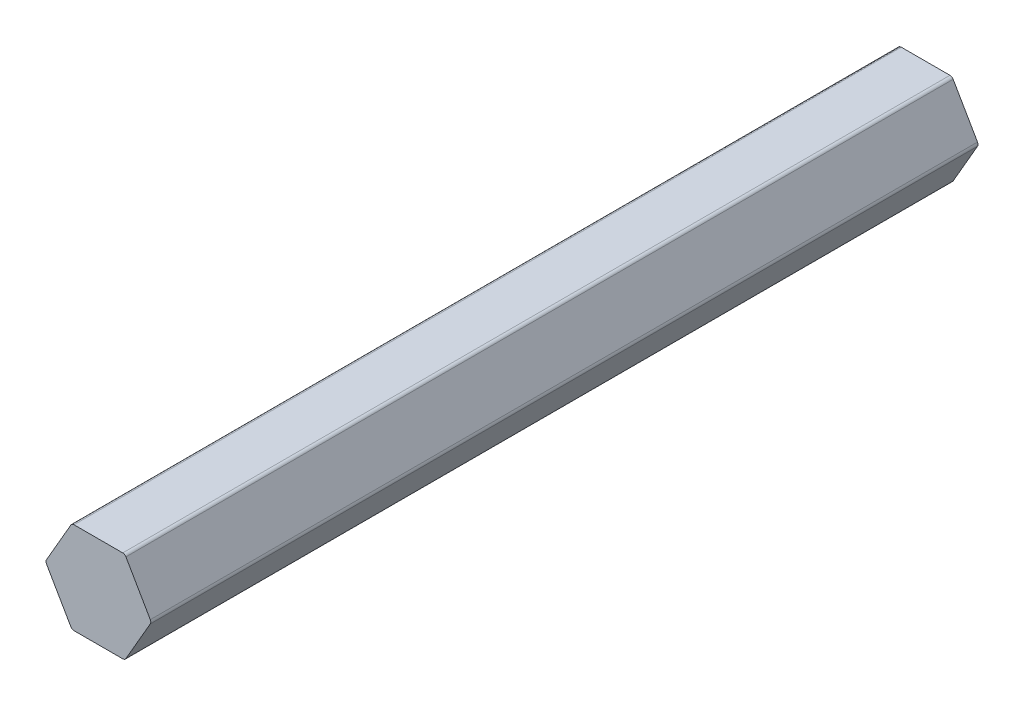
ISO-10303-21;
HEADER;
FILE_DESCRIPTION(('STEP AP214'),'2;1');
FILE_NAME('part.step','',(''),(''),'','','');
FILE_SCHEMA(('AUTOMOTIVE_DESIGN { 1 0 10303 214 1 1 1 1 }'));
ENDSEC;
DATA;
#1=APPLICATION_CONTEXT('core data for automotive mechanical design processes');
#2=APPLICATION_PROTOCOL_DEFINITION('international standard','automotive_design',2000,#1);
#3=PRODUCT_CONTEXT('',#1,'mechanical');
#4=PRODUCT('Part','Part','',(#3));
#5=PRODUCT_RELATED_PRODUCT_CATEGORY('part','',(#4));
#6=PRODUCT_DEFINITION_FORMATION('','',#4);
#7=PRODUCT_DEFINITION_CONTEXT('part definition',#1,'design');
#8=PRODUCT_DEFINITION('design','',#6,#7);
#9=PRODUCT_DEFINITION_SHAPE('','',#8);
#10=(LENGTH_UNIT() NAMED_UNIT(*) SI_UNIT(.MILLI.,.METRE.));
#11=(NAMED_UNIT(*) PLANE_ANGLE_UNIT() SI_UNIT($,.RADIAN.));
#12=(NAMED_UNIT(*) SI_UNIT($,.STERADIAN.) SOLID_ANGLE_UNIT());
#13=UNCERTAINTY_MEASURE_WITH_UNIT(LENGTH_MEASURE(1.E-05),#10,'distance_accuracy_value','');
#14=(GEOMETRIC_REPRESENTATION_CONTEXT(3) GLOBAL_UNCERTAINTY_ASSIGNED_CONTEXT((#13)) GLOBAL_UNIT_ASSIGNED_CONTEXT((#10,
#11,#12)) REPRESENTATION_CONTEXT('',''));
#15=CARTESIAN_POINT('',(0.,0.,0.));
#16=DIRECTION('',(0.,0.,1.));
#17=DIRECTION('',(1.,0.,0.));
#18=AXIS2_PLACEMENT_3D('',#15,#16,#17);
#19=CARTESIAN_POINT('',(-3.36554792418708,-5.8293,-114.3));
#20=DIRECTION('',(0.,0.,-1.));
#21=DIRECTION('',(-1.,0.,0.));
#22=AXIS2_PLACEMENT_3D('',#19,#20,#21);
#23=CYLINDRICAL_SURFACE('',#22,0.507999999999999);
#24=CARTESIAN_POINT('',(-3.36554792418708,-5.8293,-228.6));
#25=DIRECTION('',(0.,0.,-1.));
#26=DIRECTION('',(-1.,0.,0.));
#27=AXIS2_PLACEMENT_3D('',#24,#25,#26);
#28=CIRCLE('',#27,0.507999999999999);
#29=CARTESIAN_POINT('',(-3.36554792418708,-6.3373,-228.6));
#30=VERTEX_POINT('',#29);
#31=CARTESIAN_POINT('',(-3.80548882930957,-6.0833,-228.6));
#32=VERTEX_POINT('',#31);
#33=EDGE_CURVE('E155',#30,#32,#28,.T.);
#34=ORIENTED_EDGE('',*,*,#33,.F.);
#35=DIRECTION('',(0.,0.,-1.));
#36=VECTOR('',#35,1.);
#37=CARTESIAN_POINT('',(-3.36554792418708,-6.3373,-114.3));
#38=LINE('',#37,#36);
#39=CARTESIAN_POINT('',(-3.36554792418708,-6.3373,-114.3));
#40=VERTEX_POINT('',#39);
#41=EDGE_CURVE('E11',#40,#30,#38,.T.);
#42=ORIENTED_EDGE('',*,*,#41,.F.);
#43=CARTESIAN_POINT('',(-3.36554792418708,-5.8293,-114.3));
#44=DIRECTION('',(0.,0.,-1.));
#45=DIRECTION('',(-1.,0.,0.));
#46=AXIS2_PLACEMENT_3D('',#43,#44,#45);
#47=CIRCLE('',#46,0.507999999999999);
#48=CARTESIAN_POINT('',(-3.80548882930957,-6.0833,-114.3));
#49=VERTEX_POINT('',#48);
#50=EDGE_CURVE('E187',#40,#49,#47,.T.);
#51=ORIENTED_EDGE('',*,*,#50,.T.);
#52=DIRECTION('',(0.,0.,-1.));
#53=VECTOR('',#52,1.);
#54=CARTESIAN_POINT('',(-3.80548882930957,-6.0833,-114.3));
#55=LINE('',#54,#53);
#56=EDGE_CURVE('E37',#49,#32,#55,.T.);
#57=ORIENTED_EDGE('',*,*,#56,.T.);
#58=EDGE_LOOP('',(#34,#42,#51,#57));
#59=FACE_BOUND('',#58,.T.);
#60=ADVANCED_FACE('F34',(#59),#23,.T.);
#61=CARTESIAN_POINT('',(3.36554792418708,-6.3373,-114.3));
#62=DIRECTION('',(0.,-1.,0.));
#63=DIRECTION('',(1.,0.,0.));
#64=AXIS2_PLACEMENT_3D('',#61,#62,#63);
#65=PLANE('',#64);
#66=DIRECTION('',(-1.,0.,0.));
#67=VECTOR('',#66,1.);
#68=CARTESIAN_POINT('',(3.36554792418708,-6.3373,-228.6));
#69=LINE('',#68,#67);
#70=CARTESIAN_POINT('',(3.36554792418708,-6.3373,-228.6));
#71=VERTEX_POINT('',#70);
#72=EDGE_CURVE('E185',#71,#30,#69,.T.);
#73=ORIENTED_EDGE('',*,*,#72,.F.);
#74=DIRECTION('',(0.,0.,-1.));
#75=VECTOR('',#74,1.);
#76=CARTESIAN_POINT('',(3.36554792418708,-6.3373,-114.3));
#77=LINE('',#76,#75);
#78=CARTESIAN_POINT('',(3.36554792418708,-6.3373,-114.3));
#79=VERTEX_POINT('',#78);
#80=EDGE_CURVE('E43',#79,#71,#77,.T.);
#81=ORIENTED_EDGE('',*,*,#80,.F.);
#82=DIRECTION('',(-1.,0.,0.));
#83=VECTOR('',#82,1.);
#84=CARTESIAN_POINT('',(3.36554792418708,-6.3373,-114.3));
#85=LINE('',#84,#83);
#86=EDGE_CURVE('E145',#79,#40,#85,.T.);
#87=ORIENTED_EDGE('',*,*,#86,.T.);
#88=ORIENTED_EDGE('',*,*,#41,.T.);
#89=EDGE_LOOP('',(#73,#81,#87,#88));
#90=FACE_BOUND('',#89,.T.);
#91=ADVANCED_FACE('F207',(#90),#65,.T.);
#92=CARTESIAN_POINT('',(3.36554792418709,-5.8293,-114.3));
#93=DIRECTION('',(0.,0.,-1.));
#94=DIRECTION('',(-1.,0.,0.));
#95=AXIS2_PLACEMENT_3D('',#92,#93,#94);
#96=CYLINDRICAL_SURFACE('',#95,0.508);
#97=CARTESIAN_POINT('',(3.36554792418709,-5.8293,-228.6));
#98=DIRECTION('',(0.,0.,-1.));
#99=DIRECTION('',(-1.,0.,0.));
#100=AXIS2_PLACEMENT_3D('',#97,#98,#99);
#101=CIRCLE('',#100,0.508);
#102=CARTESIAN_POINT('',(3.80548882930958,-6.0833,-228.6));
#103=VERTEX_POINT('',#102);
#104=EDGE_CURVE('E132',#103,#71,#101,.T.);
#105=ORIENTED_EDGE('',*,*,#104,.F.);
#106=DIRECTION('',(0.,0.,-1.));
#107=VECTOR('',#106,1.);
#108=CARTESIAN_POINT('',(3.80548882930958,-6.0833,-114.3));
#109=LINE('',#108,#107);
#110=CARTESIAN_POINT('',(3.80548882930958,-6.0833,-114.3));
#111=VERTEX_POINT('',#110);
#112=EDGE_CURVE('E127',#111,#103,#109,.T.);
#113=ORIENTED_EDGE('',*,*,#112,.F.);
#114=CARTESIAN_POINT('',(3.36554792418709,-5.8293,-114.3));
#115=DIRECTION('',(0.,0.,-1.));
#116=DIRECTION('',(-1.,0.,0.));
#117=AXIS2_PLACEMENT_3D('',#114,#115,#116);
#118=CIRCLE('',#117,0.508);
#119=EDGE_CURVE('E130',#111,#79,#118,.T.);
#120=ORIENTED_EDGE('',*,*,#119,.T.);
#121=ORIENTED_EDGE('',*,*,#80,.T.);
#122=EDGE_LOOP('',(#105,#113,#120,#121));
#123=FACE_BOUND('',#122,.T.);
#124=ADVANCED_FACE('F129',(#123),#96,.T.);
#125=CARTESIAN_POINT('',(7.17103675349666,-0.253999999999997,-114.3));
#126=DIRECTION('',(0.866025403784439,-0.499999999999999,0.));
#127=DIRECTION('',(0.499999999999999,0.866025403784439,0.));
#128=AXIS2_PLACEMENT_3D('',#125,#126,#127);
#129=PLANE('',#128);
#130=DIRECTION('',(-0.499999999999999,-0.866025403784439,0.));
#131=VECTOR('',#130,1.);
#132=CARTESIAN_POINT('',(7.17103675349666,-0.253999999999997,-228.6));
#133=LINE('',#132,#131);
#134=CARTESIAN_POINT('',(7.17103675349666,-0.253999999999997,-228.6));
#135=VERTEX_POINT('',#134);
#136=EDGE_CURVE('E182',#135,#103,#133,.T.);
#137=ORIENTED_EDGE('',*,*,#136,.F.);
#138=DIRECTION('',(0.,0.,-1.));
#139=VECTOR('',#138,1.);
#140=CARTESIAN_POINT('',(7.17103675349666,-0.253999999999997,-114.3));
#141=LINE('',#140,#139);
#142=CARTESIAN_POINT('',(7.17103675349666,-0.253999999999997,-114.3));
#143=VERTEX_POINT('',#142);
#144=EDGE_CURVE('E137',#143,#135,#141,.T.);
#145=ORIENTED_EDGE('',*,*,#144,.F.);
#146=DIRECTION('',(-0.499999999999999,-0.866025403784439,0.));
#147=VECTOR('',#146,1.);
#148=CARTESIAN_POINT('',(7.17103675349666,-0.253999999999997,-114.3));
#149=LINE('',#148,#147);
#150=EDGE_CURVE('E143',#143,#111,#149,.T.);
#151=ORIENTED_EDGE('',*,*,#150,.T.);
#152=ORIENTED_EDGE('',*,*,#112,.T.);
#153=EDGE_LOOP('',(#137,#145,#151,#152));
#154=FACE_BOUND('',#153,.T.);
#155=ADVANCED_FACE('F147',(#154),#129,.T.);
#156=CARTESIAN_POINT('',(6.73109584837417,0.,-114.3));
#157=DIRECTION('',(0.,0.,-1.));
#158=DIRECTION('',(-1.,0.,0.));
#159=AXIS2_PLACEMENT_3D('',#156,#157,#158);
#160=CYLINDRICAL_SURFACE('',#159,0.507999999999999);
#161=CARTESIAN_POINT('',(6.73109584837417,0.,-228.6));
#162=DIRECTION('',(0.,0.,-1.));
#163=DIRECTION('',(-1.,0.,0.));
#164=AXIS2_PLACEMENT_3D('',#161,#162,#163);
#165=CIRCLE('',#164,0.507999999999999);
#166=CARTESIAN_POINT('',(7.17103675349666,0.254000000000003,-228.6));
#167=VERTEX_POINT('',#166);
#168=EDGE_CURVE('E179',#167,#135,#165,.T.);
#169=ORIENTED_EDGE('',*,*,#168,.F.);
#170=DIRECTION('',(0.,0.,-1.));
#171=VECTOR('',#170,1.);
#172=CARTESIAN_POINT('',(7.17103675349666,0.254000000000003,-114.3));
#173=LINE('',#172,#171);
#174=CARTESIAN_POINT('',(7.17103675349666,0.254000000000003,-114.3));
#175=VERTEX_POINT('',#174);
#176=EDGE_CURVE('E191',#175,#167,#173,.T.);
#177=ORIENTED_EDGE('',*,*,#176,.F.);
#178=CARTESIAN_POINT('',(6.73109584837417,0.,-114.3));
#179=DIRECTION('',(0.,0.,-1.));
#180=DIRECTION('',(-1.,0.,0.));
#181=AXIS2_PLACEMENT_3D('',#178,#179,#180);
#182=CIRCLE('',#181,0.507999999999999);
#183=EDGE_CURVE('E148',#175,#143,#182,.T.);
#184=ORIENTED_EDGE('',*,*,#183,.T.);
#185=ORIENTED_EDGE('',*,*,#144,.T.);
#186=EDGE_LOOP('',(#169,#177,#184,#185));
#187=FACE_BOUND('',#186,.T.);
#188=ADVANCED_FACE('F220',(#187),#160,.T.);
#189=CARTESIAN_POINT('',(3.80548882930958,6.0833,-114.3));
#190=DIRECTION('',(0.866025403784439,0.5,0.));
#191=DIRECTION('',(-0.5,0.866025403784439,0.));
#192=AXIS2_PLACEMENT_3D('',#189,#190,#191);
#193=PLANE('',#192);
#194=DIRECTION('',(0.5,-0.866025403784439,0.));
#195=VECTOR('',#194,1.);
#196=CARTESIAN_POINT('',(3.80548882930958,6.0833,-228.6));
#197=LINE('',#196,#195);
#198=CARTESIAN_POINT('',(3.80548882930958,6.0833,-228.6));
#199=VERTEX_POINT('',#198);
#200=EDGE_CURVE('E176',#199,#167,#197,.T.);
#201=ORIENTED_EDGE('',*,*,#200,.F.);
#202=DIRECTION('',(0.,0.,-1.));
#203=VECTOR('',#202,1.);
#204=CARTESIAN_POINT('',(3.80548882930958,6.0833,-114.3));
#205=LINE('',#204,#203);
#206=CARTESIAN_POINT('',(3.80548882930958,6.0833,-114.3));
#207=VERTEX_POINT('',#206);
#208=EDGE_CURVE('E193',#207,#199,#205,.T.);
#209=ORIENTED_EDGE('',*,*,#208,.F.);
#210=DIRECTION('',(0.5,-0.866025403784439,0.));
#211=VECTOR('',#210,1.);
#212=CARTESIAN_POINT('',(3.80548882930958,6.0833,-114.3));
#213=LINE('',#212,#211);
#214=EDGE_CURVE('E150',#207,#175,#213,.T.);
#215=ORIENTED_EDGE('',*,*,#214,.T.);
#216=ORIENTED_EDGE('',*,*,#176,.T.);
#217=EDGE_LOOP('',(#201,#209,#215,#216));
#218=FACE_BOUND('',#217,.T.);
#219=ADVANCED_FACE('F223',(#218),#193,.T.);
#220=CARTESIAN_POINT('',(3.36554792418708,5.8293,-114.3));
#221=DIRECTION('',(0.,0.,-1.));
#222=DIRECTION('',(-1.,0.,0.));
#223=AXIS2_PLACEMENT_3D('',#220,#221,#222);
#224=CYLINDRICAL_SURFACE('',#223,0.508);
#225=CARTESIAN_POINT('',(3.36554792418708,5.8293,-228.6));
#226=DIRECTION('',(0.,0.,-1.));
#227=DIRECTION('',(-1.,0.,0.));
#228=AXIS2_PLACEMENT_3D('',#225,#226,#227);
#229=CIRCLE('',#228,0.508);
#230=CARTESIAN_POINT('',(3.36554792418708,6.3373,-228.6));
#231=VERTEX_POINT('',#230);
#232=EDGE_CURVE('E173',#231,#199,#229,.T.);
#233=ORIENTED_EDGE('',*,*,#232,.F.);
#234=DIRECTION('',(0.,0.,-1.));
#235=VECTOR('',#234,1.);
#236=CARTESIAN_POINT('',(3.36554792418708,6.3373,-114.3));
#237=LINE('',#236,#235);
#238=CARTESIAN_POINT('',(3.36554792418708,6.3373,-114.3));
#239=VERTEX_POINT('',#238);
#240=EDGE_CURVE('E195',#239,#231,#237,.T.);
#241=ORIENTED_EDGE('',*,*,#240,.F.);
#242=CARTESIAN_POINT('',(3.36554792418708,5.8293,-114.3));
#243=DIRECTION('',(0.,0.,-1.));
#244=DIRECTION('',(-1.,0.,0.));
#245=AXIS2_PLACEMENT_3D('',#242,#243,#244);
#246=CIRCLE('',#245,0.508);
#247=EDGE_CURVE('E349',#239,#207,#246,.T.);
#248=ORIENTED_EDGE('',*,*,#247,.T.);
#249=ORIENTED_EDGE('',*,*,#208,.T.);
#250=EDGE_LOOP('',(#233,#241,#248,#249));
#251=FACE_BOUND('',#250,.T.);
#252=ADVANCED_FACE('F227',(#251),#224,.T.);
#253=CARTESIAN_POINT('',(-3.36554792418708,6.3373,-114.3));
#254=DIRECTION('',(0.,1.,0.));
#255=DIRECTION('',(-1.,0.,0.));
#256=AXIS2_PLACEMENT_3D('',#253,#254,#255);
#257=PLANE('',#256);
#258=DIRECTION('',(1.,0.,0.));
#259=VECTOR('',#258,1.);
#260=CARTESIAN_POINT('',(-3.36554792418708,6.3373,-228.6));
#261=LINE('',#260,#259);
#262=CARTESIAN_POINT('',(-3.36554792418708,6.3373,-228.6));
#263=VERTEX_POINT('',#262);
#264=EDGE_CURVE('E170',#263,#231,#261,.T.);
#265=ORIENTED_EDGE('',*,*,#264,.F.);
#266=DIRECTION('',(0.,0.,-1.));
#267=VECTOR('',#266,1.);
#268=CARTESIAN_POINT('',(-3.36554792418708,6.3373,-114.3));
#269=LINE('',#268,#267);
#270=CARTESIAN_POINT('',(-3.36554792418708,6.3373,-114.3));
#271=VERTEX_POINT('',#270);
#272=EDGE_CURVE('E197',#271,#263,#269,.T.);
#273=ORIENTED_EDGE('',*,*,#272,.F.);
#274=DIRECTION('',(1.,0.,0.));
#275=VECTOR('',#274,1.);
#276=CARTESIAN_POINT('',(-3.36554792418708,6.3373,-114.3));
#277=LINE('',#276,#275);
#278=EDGE_CURVE('E353',#271,#239,#277,.T.);
#279=ORIENTED_EDGE('',*,*,#278,.T.);
#280=ORIENTED_EDGE('',*,*,#240,.T.);
#281=EDGE_LOOP('',(#265,#273,#279,#280));
#282=FACE_BOUND('',#281,.T.);
#283=ADVANCED_FACE('F231',(#282),#257,.T.);
#284=CARTESIAN_POINT('',(-3.36554792418708,5.8293,-114.3));
#285=DIRECTION('',(0.,0.,-1.));
#286=DIRECTION('',(-1.,0.,0.));
#287=AXIS2_PLACEMENT_3D('',#284,#285,#286);
#288=CYLINDRICAL_SURFACE('',#287,0.508);
#289=CARTESIAN_POINT('',(-3.36554792418708,5.8293,-228.6));
#290=DIRECTION('',(0.,0.,-1.));
#291=DIRECTION('',(-1.,0.,0.));
#292=AXIS2_PLACEMENT_3D('',#289,#290,#291);
#293=CIRCLE('',#292,0.508);
#294=CARTESIAN_POINT('',(-3.80548882930958,6.0833,-228.6));
#295=VERTEX_POINT('',#294);
#296=EDGE_CURVE('E167',#295,#263,#293,.T.);
#297=ORIENTED_EDGE('',*,*,#296,.F.);
#298=DIRECTION('',(0.,0.,-1.));
#299=VECTOR('',#298,1.);
#300=CARTESIAN_POINT('',(-3.80548882930958,6.0833,-114.3));
#301=LINE('',#300,#299);
#302=CARTESIAN_POINT('',(-3.80548882930958,6.0833,-114.3));
#303=VERTEX_POINT('',#302);
#304=EDGE_CURVE('E199',#303,#295,#301,.T.);
#305=ORIENTED_EDGE('',*,*,#304,.F.);
#306=CARTESIAN_POINT('',(-3.36554792418708,5.8293,-114.3));
#307=DIRECTION('',(0.,0.,-1.));
#308=DIRECTION('',(-1.,0.,0.));
#309=AXIS2_PLACEMENT_3D('',#306,#307,#308);
#310=CIRCLE('',#309,0.508);
#311=EDGE_CURVE('E342',#303,#271,#310,.T.);
#312=ORIENTED_EDGE('',*,*,#311,.T.);
#313=ORIENTED_EDGE('',*,*,#272,.T.);
#314=EDGE_LOOP('',(#297,#305,#312,#313));
#315=FACE_BOUND('',#314,.T.);
#316=ADVANCED_FACE('F235',(#315),#288,.T.);
#317=CARTESIAN_POINT('',(-7.17103675349666,0.253999999999996,-114.3));
#318=DIRECTION('',(-0.866025403784439,0.5,0.));
#319=DIRECTION('',(-0.5,-0.866025403784439,0.));
#320=AXIS2_PLACEMENT_3D('',#317,#318,#319);
#321=PLANE('',#320);
#322=DIRECTION('',(0.5,0.866025403784439,0.));
#323=VECTOR('',#322,1.);
#324=CARTESIAN_POINT('',(-7.17103675349666,0.253999999999996,-228.6));
#325=LINE('',#324,#323);
#326=CARTESIAN_POINT('',(-7.17103675349666,0.253999999999996,-228.6));
#327=VERTEX_POINT('',#326);
#328=EDGE_CURVE('E164',#327,#295,#325,.T.);
#329=ORIENTED_EDGE('',*,*,#328,.F.);
#330=DIRECTION('',(0.,0.,-1.));
#331=VECTOR('',#330,1.);
#332=CARTESIAN_POINT('',(-7.17103675349666,0.253999999999996,-114.3));
#333=LINE('',#332,#331);
#334=CARTESIAN_POINT('',(-7.17103675349666,0.253999999999996,-114.3));
#335=VERTEX_POINT('',#334);
#336=EDGE_CURVE('E201',#335,#327,#333,.T.);
#337=ORIENTED_EDGE('',*,*,#336,.F.);
#338=DIRECTION('',(0.5,0.866025403784439,0.));
#339=VECTOR('',#338,1.);
#340=CARTESIAN_POINT('',(-7.17103675349666,0.253999999999996,-114.3));
#341=LINE('',#340,#339);
#342=EDGE_CURVE('E338',#335,#303,#341,.T.);
#343=ORIENTED_EDGE('',*,*,#342,.T.);
#344=ORIENTED_EDGE('',*,*,#304,.T.);
#345=EDGE_LOOP('',(#329,#337,#343,#344));
#346=FACE_BOUND('',#345,.T.);
#347=ADVANCED_FACE('F239',(#346),#321,.T.);
#348=CARTESIAN_POINT('',(-6.73109584837417,0.,-114.3));
#349=DIRECTION('',(0.,0.,-1.));
#350=DIRECTION('',(-1.,0.,0.));
#351=AXIS2_PLACEMENT_3D('',#348,#349,#350);
#352=CYLINDRICAL_SURFACE('',#351,0.508000000000001);
#353=CARTESIAN_POINT('',(-6.73109584837417,0.,-228.6));
#354=DIRECTION('',(0.,0.,-1.));
#355=DIRECTION('',(-1.,0.,0.));
#356=AXIS2_PLACEMENT_3D('',#353,#354,#355);
#357=CIRCLE('',#356,0.508000000000001);
#358=CARTESIAN_POINT('',(-7.17103675349666,-0.254000000000005,-228.6));
#359=VERTEX_POINT('',#358);
#360=EDGE_CURVE('E161',#359,#327,#357,.T.);
#361=ORIENTED_EDGE('',*,*,#360,.F.);
#362=DIRECTION('',(0.,0.,-1.));
#363=VECTOR('',#362,1.);
#364=CARTESIAN_POINT('',(-7.17103675349666,-0.254000000000005,-114.3));
#365=LINE('',#364,#363);
#366=CARTESIAN_POINT('',(-7.17103675349666,-0.254000000000005,-114.3));
#367=VERTEX_POINT('',#366);
#368=EDGE_CURVE('E202',#367,#359,#365,.T.);
#369=ORIENTED_EDGE('',*,*,#368,.F.);
#370=CARTESIAN_POINT('',(-6.73109584837417,0.,-114.3));
#371=DIRECTION('',(0.,0.,-1.));
#372=DIRECTION('',(-1.,0.,0.));
#373=AXIS2_PLACEMENT_3D('',#370,#371,#372);
#374=CIRCLE('',#373,0.508000000000001);
#375=EDGE_CURVE('E359',#367,#335,#374,.T.);
#376=ORIENTED_EDGE('',*,*,#375,.T.);
#377=ORIENTED_EDGE('',*,*,#336,.T.);
#378=EDGE_LOOP('',(#361,#369,#376,#377));
#379=FACE_BOUND('',#378,.T.);
#380=ADVANCED_FACE('F243',(#379),#352,.T.);
#381=CARTESIAN_POINT('',(-3.80548882930957,-6.0833,-114.3));
#382=DIRECTION('',(-0.866025403784438,-0.5,0.));
#383=DIRECTION('',(0.5,-0.866025403784438,0.));
#384=AXIS2_PLACEMENT_3D('',#381,#382,#383);
#385=PLANE('',#384);
#386=DIRECTION('',(-0.500000000000001,0.866025403784438,0.));
#387=VECTOR('',#386,1.);
#388=CARTESIAN_POINT('',(-3.80548882930957,-6.0833,-228.6));
#389=LINE('',#388,#387);
#390=EDGE_CURVE('E158',#32,#359,#389,.T.);
#391=ORIENTED_EDGE('',*,*,#390,.F.);
#392=ORIENTED_EDGE('',*,*,#56,.F.);
#393=DIRECTION('',(-0.500000000000001,0.866025403784438,0.));
#394=VECTOR('',#393,1.);
#395=CARTESIAN_POINT('',(-3.80548882930957,-6.0833,-114.3));
#396=LINE('',#395,#394);
#397=EDGE_CURVE('E361',#49,#367,#396,.T.);
#398=ORIENTED_EDGE('',*,*,#397,.T.);
#399=ORIENTED_EDGE('',*,*,#368,.T.);
#400=EDGE_LOOP('',(#391,#392,#398,#399));
#401=FACE_BOUND('',#400,.T.);
#402=ADVANCED_FACE('F204',(#401),#385,.T.);
#403=CARTESIAN_POINT('',(-3.36554792418708,-5.8293,-114.3));
#404=DIRECTION('',(0.,0.,-1.));
#405=DIRECTION('',(-1.,0.,0.));
#406=AXIS2_PLACEMENT_3D('',#403,#404,#405);
#407=PLANE('',#406);
#408=ORIENTED_EDGE('',*,*,#50,.F.);
#409=ORIENTED_EDGE('',*,*,#86,.F.);
#410=ORIENTED_EDGE('',*,*,#119,.F.);
#411=ORIENTED_EDGE('',*,*,#150,.F.);
#412=ORIENTED_EDGE('',*,*,#183,.F.);
#413=ORIENTED_EDGE('',*,*,#214,.F.);
#414=ORIENTED_EDGE('',*,*,#247,.F.);
#415=ORIENTED_EDGE('',*,*,#278,.F.);
#416=ORIENTED_EDGE('',*,*,#311,.F.);
#417=ORIENTED_EDGE('',*,*,#342,.F.);
#418=ORIENTED_EDGE('',*,*,#375,.F.);
#419=ORIENTED_EDGE('',*,*,#397,.F.);
#420=EDGE_LOOP('',(#408,#409,#410,#411,#412,#413,#414,#415,#416,#417,#418,#419));
#421=FACE_BOUND('',#420,.T.);
#422=ADVANCED_FACE('F141',(#421),#407,.F.);
#423=CARTESIAN_POINT('',(-3.36554792418708,-5.8293,-228.6));
#424=DIRECTION('',(0.,0.,-1.));
#425=DIRECTION('',(-1.,0.,0.));
#426=AXIS2_PLACEMENT_3D('',#423,#424,#425);
#427=PLANE('',#426);
#428=ORIENTED_EDGE('',*,*,#33,.T.);
#429=ORIENTED_EDGE('',*,*,#390,.T.);
#430=ORIENTED_EDGE('',*,*,#360,.T.);
#431=ORIENTED_EDGE('',*,*,#328,.T.);
#432=ORIENTED_EDGE('',*,*,#296,.T.);
#433=ORIENTED_EDGE('',*,*,#264,.T.);
#434=ORIENTED_EDGE('',*,*,#232,.T.);
#435=ORIENTED_EDGE('',*,*,#200,.T.);
#436=ORIENTED_EDGE('',*,*,#168,.T.);
#437=ORIENTED_EDGE('',*,*,#136,.T.);
#438=ORIENTED_EDGE('',*,*,#104,.T.);
#439=ORIENTED_EDGE('',*,*,#72,.T.);
#440=EDGE_LOOP('',(#428,#429,#430,#431,#432,#433,#434,#435,#436,#437,#438,#439));
#441=FACE_BOUND('',#440,.T.);
#442=ADVANCED_FACE('F206',(#441),#427,.T.);
#443=CLOSED_SHELL('',(#60,#91,#124,#155,#188,#219,#252,#283,#316,#347,#380,#402,#422,#442));
#444=MANIFOLD_SOLID_BREP('B2',#443);
#445=ADVANCED_BREP_SHAPE_REPRESENTATION('',(#18,#444),#14);
#446=SHAPE_DEFINITION_REPRESENTATION(#9,#445);
ENDSEC;
END-ISO-10303-21;
